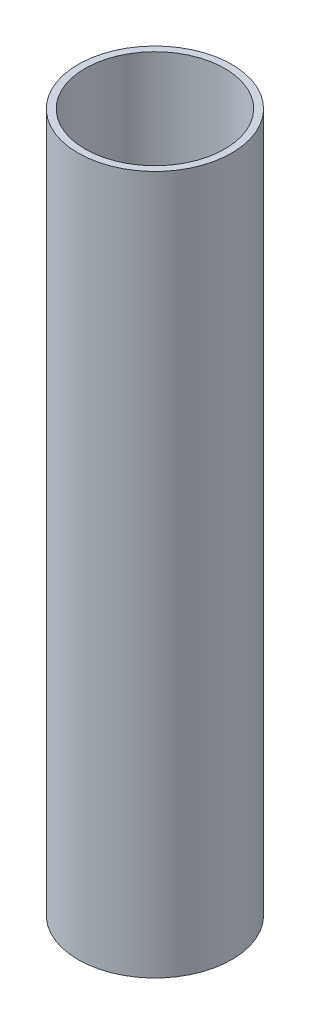
ISO-10303-21;
HEADER;
FILE_DESCRIPTION(('STEP AP214'),'2;1');
FILE_NAME('part.step','',(''),(''),'','','');
FILE_SCHEMA(('AUTOMOTIVE_DESIGN { 1 0 10303 214 1 1 1 1 }'));
ENDSEC;
DATA;
#1=APPLICATION_CONTEXT('core data for automotive mechanical design processes');
#2=APPLICATION_PROTOCOL_DEFINITION('international standard','automotive_design',2000,#1);
#3=PRODUCT_CONTEXT('',#1,'mechanical');
#4=PRODUCT('Part','Part','',(#3));
#5=PRODUCT_RELATED_PRODUCT_CATEGORY('part','',(#4));
#6=PRODUCT_DEFINITION_FORMATION('','',#4);
#7=PRODUCT_DEFINITION_CONTEXT('part definition',#1,'design');
#8=PRODUCT_DEFINITION('design','',#6,#7);
#9=PRODUCT_DEFINITION_SHAPE('','',#8);
#10=(LENGTH_UNIT() NAMED_UNIT(*) SI_UNIT(.MILLI.,.METRE.));
#11=(NAMED_UNIT(*) PLANE_ANGLE_UNIT() SI_UNIT($,.RADIAN.));
#12=(NAMED_UNIT(*) SI_UNIT($,.STERADIAN.) SOLID_ANGLE_UNIT());
#13=UNCERTAINTY_MEASURE_WITH_UNIT(LENGTH_MEASURE(1.E-05),#10,'distance_accuracy_value','');
#14=(GEOMETRIC_REPRESENTATION_CONTEXT(3) GLOBAL_UNCERTAINTY_ASSIGNED_CONTEXT((#13)) GLOBAL_UNIT_ASSIGNED_CONTEXT((#10,
#11,#12)) REPRESENTATION_CONTEXT('',''));
#15=CARTESIAN_POINT('',(0.,0.,0.));
#16=DIRECTION('',(0.,0.,1.));
#17=DIRECTION('',(1.,0.,0.));
#18=AXIS2_PLACEMENT_3D('',#15,#16,#17);
#19=CARTESIAN_POINT('',(0.,500.,0.));
#20=DIRECTION('',(0.,1.,0.));
#21=DIRECTION('',(0.,0.,1.));
#22=AXIS2_PLACEMENT_3D('',#19,#20,#21);
#23=PLANE('',#22);
#24=CARTESIAN_POINT('',(0.,500.,0.));
#25=DIRECTION('',(0.,1.,0.));
#26=DIRECTION('',(0.,0.,1.));
#27=AXIS2_PLACEMENT_3D('',#24,#25,#26);
#28=CIRCLE('',#27,55.);
#29=CARTESIAN_POINT('',(0.,500.,55.));
#30=VERTEX_POINT('',#29);
#31=EDGE_CURVE('E10',#30,#30,#28,.T.);
#32=ORIENTED_EDGE('',*,*,#31,.T.);
#33=EDGE_LOOP('',(#32));
#34=FACE_BOUND('',#33,.T.);
#35=CARTESIAN_POINT('',(0.,500.,0.));
#36=DIRECTION('',(0.,1.,0.));
#37=DIRECTION('',(0.,0.,1.));
#38=AXIS2_PLACEMENT_3D('',#35,#36,#37);
#39=CIRCLE('',#38,50.);
#40=CARTESIAN_POINT('',(0.,500.,50.));
#41=VERTEX_POINT('',#40);
#42=EDGE_CURVE('E57',#41,#41,#39,.T.);
#43=ORIENTED_EDGE('',*,*,#42,.F.);
#44=EDGE_LOOP('',(#43));
#45=FACE_BOUND('',#44,.T.);
#46=ADVANCED_FACE('F44',(#34,#45),#23,.T.);
#47=CARTESIAN_POINT('',(0.,0.,0.));
#48=DIRECTION('',(0.,1.,0.));
#49=DIRECTION('',(0.,0.,1.));
#50=AXIS2_PLACEMENT_3D('',#47,#48,#49);
#51=PLANE('',#50);
#52=CARTESIAN_POINT('',(0.,0.,0.));
#53=DIRECTION('',(0.,1.,0.));
#54=DIRECTION('',(0.,0.,1.));
#55=AXIS2_PLACEMENT_3D('',#52,#53,#54);
#56=CIRCLE('',#55,55.);
#57=CARTESIAN_POINT('',(0.,0.,55.));
#58=VERTEX_POINT('',#57);
#59=EDGE_CURVE('E48',#58,#58,#56,.T.);
#60=ORIENTED_EDGE('',*,*,#59,.F.);
#61=EDGE_LOOP('',(#60));
#62=FACE_BOUND('',#61,.T.);
#63=CARTESIAN_POINT('',(0.,0.,0.));
#64=DIRECTION('',(0.,1.,0.));
#65=DIRECTION('',(0.,0.,1.));
#66=AXIS2_PLACEMENT_3D('',#63,#64,#65);
#67=CIRCLE('',#66,50.);
#68=CARTESIAN_POINT('',(0.,0.,50.));
#69=VERTEX_POINT('',#68);
#70=EDGE_CURVE('E59',#69,#69,#67,.T.);
#71=ORIENTED_EDGE('',*,*,#70,.T.);
#72=EDGE_LOOP('',(#71));
#73=FACE_BOUND('',#72,.T.);
#74=ADVANCED_FACE('F71',(#62,#73),#51,.F.);
#75=CARTESIAN_POINT('',(0.,500.,0.));
#76=DIRECTION('',(0.,-1.,0.));
#77=DIRECTION('',(0.,0.,-1.));
#78=AXIS2_PLACEMENT_3D('',#75,#76,#77);
#79=CYLINDRICAL_SURFACE('',#78,55.);
#80=ORIENTED_EDGE('',*,*,#31,.F.);
#81=EDGE_LOOP('',(#80));
#82=FACE_BOUND('',#81,.T.);
#83=ORIENTED_EDGE('',*,*,#59,.T.);
#84=EDGE_LOOP('',(#83));
#85=FACE_BOUND('',#84,.T.);
#86=ADVANCED_FACE('F46',(#82,#85),#79,.T.);
#87=CARTESIAN_POINT('',(0.,500.,0.));
#88=DIRECTION('',(0.,-1.,0.));
#89=DIRECTION('',(0.,0.,-1.));
#90=AXIS2_PLACEMENT_3D('',#87,#88,#89);
#91=CYLINDRICAL_SURFACE('',#90,50.);
#92=ORIENTED_EDGE('',*,*,#42,.T.);
#93=EDGE_LOOP('',(#92));
#94=FACE_BOUND('',#93,.T.);
#95=ORIENTED_EDGE('',*,*,#70,.F.);
#96=EDGE_LOOP('',(#95));
#97=FACE_BOUND('',#96,.T.);
#98=ADVANCED_FACE('F67',(#94,#97),#91,.F.);
#99=CLOSED_SHELL('',(#46,#74,#86,#98));
#100=MANIFOLD_SOLID_BREP('B2',#99);
#101=ADVANCED_BREP_SHAPE_REPRESENTATION('',(#18,#100),#14);
#102=SHAPE_DEFINITION_REPRESENTATION(#9,#101);
ENDSEC;
END-ISO-10303-21;
